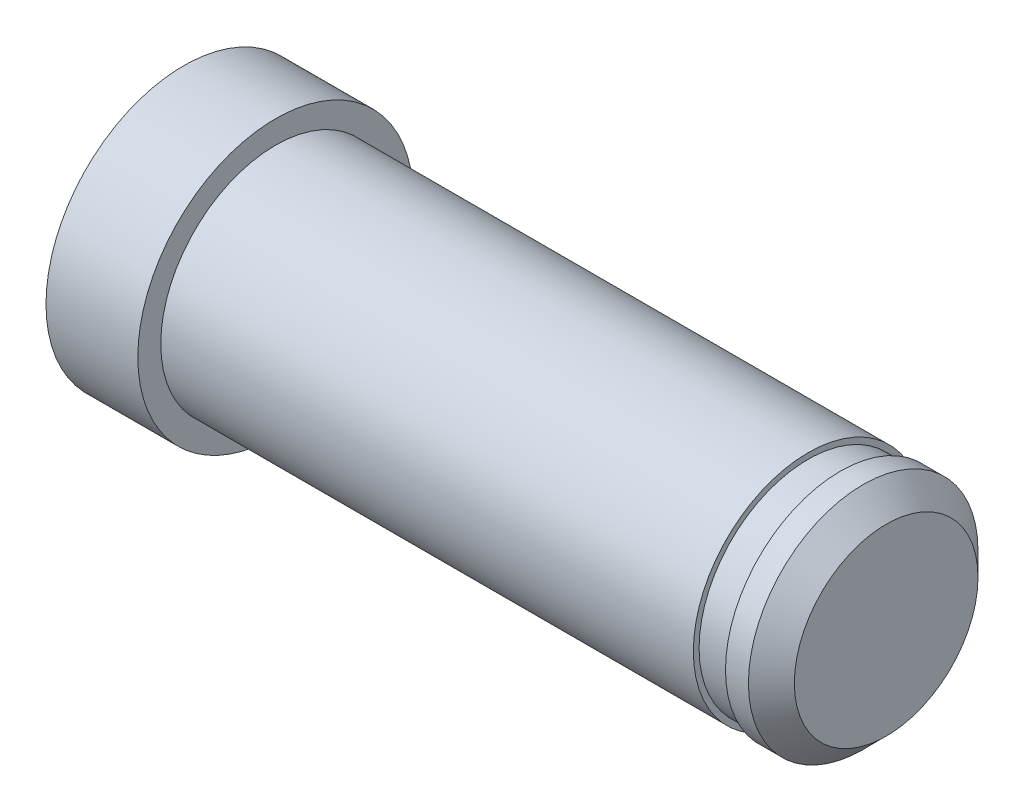
ISO-10303-21;
HEADER;
FILE_DESCRIPTION(('STEP AP214'),'2;1');
FILE_NAME('part.step','',(''),(''),'','','');
FILE_SCHEMA(('AUTOMOTIVE_DESIGN { 1 0 10303 214 1 1 1 1 }'));
ENDSEC;
DATA;
#1=APPLICATION_CONTEXT('core data for automotive mechanical design processes');
#2=APPLICATION_PROTOCOL_DEFINITION('international standard','automotive_design',2000,#1);
#3=PRODUCT_CONTEXT('',#1,'mechanical');
#4=PRODUCT('Part','Part','',(#3));
#5=PRODUCT_RELATED_PRODUCT_CATEGORY('part','',(#4));
#6=PRODUCT_DEFINITION_FORMATION('','',#4);
#7=PRODUCT_DEFINITION_CONTEXT('part definition',#1,'design');
#8=PRODUCT_DEFINITION('design','',#6,#7);
#9=PRODUCT_DEFINITION_SHAPE('','',#8);
#10=(LENGTH_UNIT() NAMED_UNIT(*) SI_UNIT(.MILLI.,.METRE.));
#11=(NAMED_UNIT(*) PLANE_ANGLE_UNIT() SI_UNIT($,.RADIAN.));
#12=(NAMED_UNIT(*) SI_UNIT($,.STERADIAN.) SOLID_ANGLE_UNIT());
#13=UNCERTAINTY_MEASURE_WITH_UNIT(LENGTH_MEASURE(1.E-05),#10,'distance_accuracy_value','');
#14=(GEOMETRIC_REPRESENTATION_CONTEXT(3) GLOBAL_UNCERTAINTY_ASSIGNED_CONTEXT((#13)) GLOBAL_UNIT_ASSIGNED_CONTEXT((#10,
#11,#12)) REPRESENTATION_CONTEXT('',''));
#15=CARTESIAN_POINT('',(0.,0.,0.));
#16=DIRECTION('',(0.,0.,1.));
#17=DIRECTION('',(1.,0.,0.));
#18=AXIS2_PLACEMENT_3D('',#15,#16,#17);
#19=CARTESIAN_POINT('',(-15.3,0.,0.));
#20=DIRECTION('',(1.,0.,0.));
#21=DIRECTION('',(0.,0.,-1.));
#22=AXIS2_PLACEMENT_3D('',#19,#20,#21);
#23=PLANE('',#22);
#24=CARTESIAN_POINT('',(-15.3,0.,0.));
#25=DIRECTION('',(-1.,0.,0.));
#26=DIRECTION('',(0.,0.,1.));
#27=AXIS2_PLACEMENT_3D('',#24,#25,#26);
#28=CIRCLE('',#27,3.);
#29=CARTESIAN_POINT('',(-15.3,0.,3.));
#30=VERTEX_POINT('',#29);
#31=EDGE_CURVE('E74',#30,#30,#28,.T.);
#32=ORIENTED_EDGE('',*,*,#31,.T.);
#33=EDGE_LOOP('',(#32));
#34=FACE_BOUND('',#33,.T.);
#35=ADVANCED_FACE('F41',(#34),#23,.F.);
#36=CARTESIAN_POINT('',(0.,0.,0.));
#37=DIRECTION('',(-1.,0.,0.));
#38=DIRECTION('',(0.,0.,1.));
#39=AXIS2_PLACEMENT_3D('',#36,#37,#38);
#40=PLANE('',#39);
#41=CARTESIAN_POINT('',(0.,0.,0.));
#42=DIRECTION('',(-1.,0.,0.));
#43=DIRECTION('',(0.,0.,1.));
#44=AXIS2_PLACEMENT_3D('',#41,#42,#43);
#45=CIRCLE('',#44,2.);
#46=CARTESIAN_POINT('',(0.,0.,2.));
#47=VERTEX_POINT('',#46);
#48=EDGE_CURVE('E10',#47,#47,#45,.F.);
#49=ORIENTED_EDGE('',*,*,#48,.T.);
#50=EDGE_LOOP('',(#49));
#51=FACE_BOUND('',#50,.T.);
#52=ADVANCED_FACE('F117',(#51),#40,.F.);
#53=CARTESIAN_POINT('',(-15.3,0.,0.));
#54=DIRECTION('',(-1.,0.,0.));
#55=DIRECTION('',(0.,0.,1.));
#56=AXIS2_PLACEMENT_3D('',#53,#54,#55);
#57=CYLINDRICAL_SURFACE('',#56,2.5);
#58=CARTESIAN_POINT('',(-0.5,0.,0.));
#59=DIRECTION('',(-1.,0.,0.));
#60=DIRECTION('',(0.,0.,1.));
#61=AXIS2_PLACEMENT_3D('',#58,#59,#60);
#62=CIRCLE('',#61,2.5);
#63=CARTESIAN_POINT('',(-0.5,0.,2.5));
#64=VERTEX_POINT('',#63);
#65=EDGE_CURVE('E49',#64,#64,#62,.T.);
#66=ORIENTED_EDGE('',*,*,#65,.T.);
#67=EDGE_LOOP('',(#66));
#68=FACE_BOUND('',#67,.T.);
#69=CARTESIAN_POINT('',(-1.,0.,0.));
#70=DIRECTION('',(-1.,0.,0.));
#71=DIRECTION('',(0.,0.,1.));
#72=AXIS2_PLACEMENT_3D('',#69,#70,#71);
#73=CIRCLE('',#72,2.5);
#74=CARTESIAN_POINT('',(-1.,0.,2.5));
#75=VERTEX_POINT('',#74);
#76=EDGE_CURVE('E53',#75,#75,#73,.T.);
#77=ORIENTED_EDGE('',*,*,#76,.F.);
#78=EDGE_LOOP('',(#77));
#79=FACE_BOUND('',#78,.T.);
#80=ADVANCED_FACE('F112',(#68,#79),#57,.T.);
#81=CARTESIAN_POINT('',(-1.,2.5,0.));
#82=DIRECTION('',(1.,0.,0.));
#83=DIRECTION('',(0.,0.,-1.));
#84=AXIS2_PLACEMENT_3D('',#81,#82,#83);
#85=PLANE('',#84);
#86=CARTESIAN_POINT('',(-1.,0.,0.));
#87=DIRECTION('',(-1.,0.,0.));
#88=DIRECTION('',(0.,0.,1.));
#89=AXIS2_PLACEMENT_3D('',#86,#87,#88);
#90=CIRCLE('',#89,2.375);
#91=CARTESIAN_POINT('',(-1.,0.,2.375));
#92=VERTEX_POINT('',#91);
#93=EDGE_CURVE('E57',#92,#92,#90,.T.);
#94=ORIENTED_EDGE('',*,*,#93,.F.);
#95=EDGE_LOOP('',(#94));
#96=FACE_BOUND('',#95,.T.);
#97=ORIENTED_EDGE('',*,*,#76,.T.);
#98=EDGE_LOOP('',(#97));
#99=FACE_BOUND('',#98,.T.);
#100=ADVANCED_FACE('F106',(#96,#99),#85,.F.);
#101=CARTESIAN_POINT('',(-15.3,0.,0.));
#102=DIRECTION('',(-1.,0.,0.));
#103=DIRECTION('',(0.,0.,1.));
#104=AXIS2_PLACEMENT_3D('',#101,#102,#103);
#105=CYLINDRICAL_SURFACE('',#104,2.375);
#106=CARTESIAN_POINT('',(-1.7,0.,0.));
#107=DIRECTION('',(-1.,0.,0.));
#108=DIRECTION('',(0.,0.,1.));
#109=AXIS2_PLACEMENT_3D('',#106,#107,#108);
#110=CIRCLE('',#109,2.375);
#111=CARTESIAN_POINT('',(-1.7,0.,2.375));
#112=VERTEX_POINT('',#111);
#113=EDGE_CURVE('E62',#112,#112,#110,.T.);
#114=ORIENTED_EDGE('',*,*,#113,.F.);
#115=EDGE_LOOP('',(#114));
#116=FACE_BOUND('',#115,.T.);
#117=ORIENTED_EDGE('',*,*,#93,.T.);
#118=EDGE_LOOP('',(#117));
#119=FACE_BOUND('',#118,.T.);
#120=ADVANCED_FACE('F100',(#116,#119),#105,.T.);
#121=CARTESIAN_POINT('',(-1.7,2.5,0.));
#122=DIRECTION('',(-1.,0.,0.));
#123=DIRECTION('',(0.,0.,1.));
#124=AXIS2_PLACEMENT_3D('',#121,#122,#123);
#125=PLANE('',#124);
#126=CARTESIAN_POINT('',(-1.7,0.,0.));
#127=DIRECTION('',(-1.,0.,0.));
#128=DIRECTION('',(0.,0.,1.));
#129=AXIS2_PLACEMENT_3D('',#126,#127,#128);
#130=CIRCLE('',#129,2.5);
#131=CARTESIAN_POINT('',(-1.7,0.,2.5));
#132=VERTEX_POINT('',#131);
#133=EDGE_CURVE('E65',#132,#132,#130,.T.);
#134=ORIENTED_EDGE('',*,*,#133,.F.);
#135=EDGE_LOOP('',(#134));
#136=FACE_BOUND('',#135,.T.);
#137=ORIENTED_EDGE('',*,*,#113,.T.);
#138=EDGE_LOOP('',(#137));
#139=FACE_BOUND('',#138,.T.);
#140=ADVANCED_FACE('F94',(#136,#139),#125,.F.);
#141=CARTESIAN_POINT('',(-15.3,0.,0.));
#142=DIRECTION('',(-1.,0.,0.));
#143=DIRECTION('',(0.,0.,1.));
#144=AXIS2_PLACEMENT_3D('',#141,#142,#143);
#145=CYLINDRICAL_SURFACE('',#144,2.5);
#146=CARTESIAN_POINT('',(-13.3,0.,0.));
#147=DIRECTION('',(-1.,0.,0.));
#148=DIRECTION('',(0.,0.,1.));
#149=AXIS2_PLACEMENT_3D('',#146,#147,#148);
#150=CIRCLE('',#149,2.5);
#151=CARTESIAN_POINT('',(-13.3,0.,2.5));
#152=VERTEX_POINT('',#151);
#153=EDGE_CURVE('E68',#152,#152,#150,.T.);
#154=ORIENTED_EDGE('',*,*,#153,.F.);
#155=EDGE_LOOP('',(#154));
#156=FACE_BOUND('',#155,.T.);
#157=ORIENTED_EDGE('',*,*,#133,.T.);
#158=EDGE_LOOP('',(#157));
#159=FACE_BOUND('',#158,.T.);
#160=ADVANCED_FACE('F88',(#156,#159),#145,.T.);
#161=CARTESIAN_POINT('',(-13.3,2.5,0.));
#162=DIRECTION('',(-1.,0.,0.));
#163=DIRECTION('',(0.,0.,1.));
#164=AXIS2_PLACEMENT_3D('',#161,#162,#163);
#165=PLANE('',#164);
#166=CARTESIAN_POINT('',(-13.3,0.,0.));
#167=DIRECTION('',(-1.,0.,0.));
#168=DIRECTION('',(0.,0.,1.));
#169=AXIS2_PLACEMENT_3D('',#166,#167,#168);
#170=CIRCLE('',#169,3.);
#171=CARTESIAN_POINT('',(-13.3,0.,3.));
#172=VERTEX_POINT('',#171);
#173=EDGE_CURVE('E71',#172,#172,#170,.T.);
#174=ORIENTED_EDGE('',*,*,#173,.F.);
#175=EDGE_LOOP('',(#174));
#176=FACE_BOUND('',#175,.T.);
#177=ORIENTED_EDGE('',*,*,#153,.T.);
#178=EDGE_LOOP('',(#177));
#179=FACE_BOUND('',#178,.T.);
#180=ADVANCED_FACE('F82',(#176,#179),#165,.F.);
#181=CARTESIAN_POINT('',(-15.3,0.,0.));
#182=DIRECTION('',(-1.,0.,0.));
#183=DIRECTION('',(0.,0.,1.));
#184=AXIS2_PLACEMENT_3D('',#181,#182,#183);
#185=CYLINDRICAL_SURFACE('',#184,3.);
#186=ORIENTED_EDGE('',*,*,#31,.F.);
#187=EDGE_LOOP('',(#186));
#188=FACE_BOUND('',#187,.T.);
#189=ORIENTED_EDGE('',*,*,#173,.T.);
#190=EDGE_LOOP('',(#189));
#191=FACE_BOUND('',#190,.T.);
#192=ADVANCED_FACE('F79',(#188,#191),#185,.T.);
#193=CARTESIAN_POINT('',(-0.5,0.,0.));
#194=DIRECTION('',(-1.,0.,0.));
#195=DIRECTION('',(0.,0.,1.));
#196=AXIS2_PLACEMENT_3D('',#193,#194,#195);
#197=CONICAL_SURFACE('',#196,2.5,0.78539816339745);
#198=ORIENTED_EDGE('',*,*,#48,.F.);
#199=EDGE_LOOP('',(#198));
#200=FACE_BOUND('',#199,.T.);
#201=ORIENTED_EDGE('',*,*,#65,.F.);
#202=EDGE_LOOP('',(#201));
#203=FACE_BOUND('',#202,.T.);
#204=ADVANCED_FACE('F44',(#200,#203),#197,.T.);
#205=CLOSED_SHELL('',(#35,#52,#80,#100,#120,#140,#160,#180,#192,#204));
#206=MANIFOLD_SOLID_BREP('B2',#205);
#207=ADVANCED_BREP_SHAPE_REPRESENTATION('',(#18,#206),#14);
#208=SHAPE_DEFINITION_REPRESENTATION(#9,#207);
ENDSEC;
END-ISO-10303-21;
